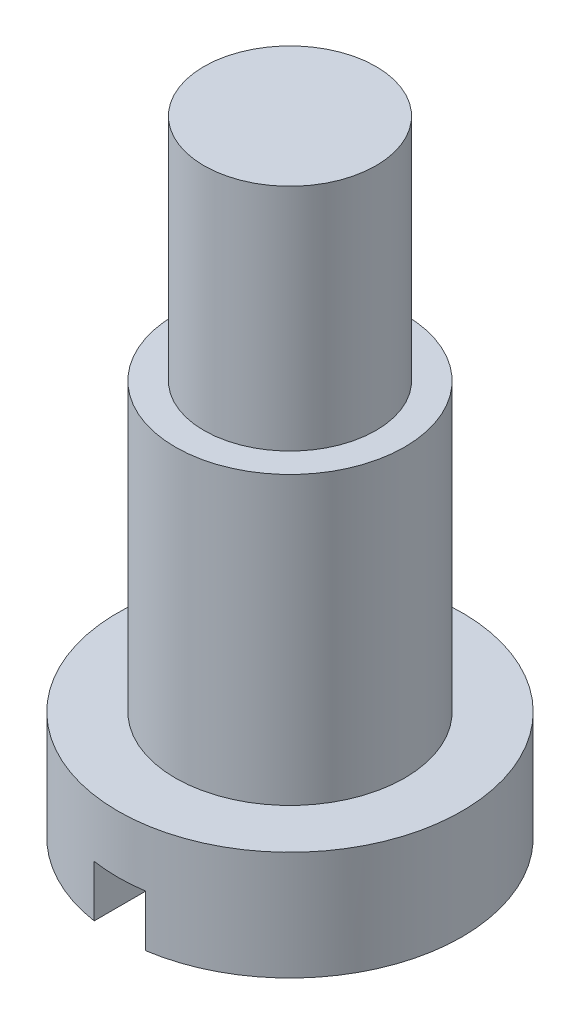
ISO-10303-21;
HEADER;
FILE_DESCRIPTION(('STEP AP214'),'2;1');
FILE_NAME('part.step','',(''),(''),'','','');
FILE_SCHEMA(('AUTOMOTIVE_DESIGN { 1 0 10303 214 1 1 1 1 }'));
ENDSEC;
DATA;
#1=APPLICATION_CONTEXT('core data for automotive mechanical design processes');
#2=APPLICATION_PROTOCOL_DEFINITION('international standard','automotive_design',2000,#1);
#3=PRODUCT_CONTEXT('',#1,'mechanical');
#4=PRODUCT('Part','Part','',(#3));
#5=PRODUCT_RELATED_PRODUCT_CATEGORY('part','',(#4));
#6=PRODUCT_DEFINITION_FORMATION('','',#4);
#7=PRODUCT_DEFINITION_CONTEXT('part definition',#1,'design');
#8=PRODUCT_DEFINITION('design','',#6,#7);
#9=PRODUCT_DEFINITION_SHAPE('','',#8);
#10=(LENGTH_UNIT() NAMED_UNIT(*) SI_UNIT(.MILLI.,.METRE.));
#11=(NAMED_UNIT(*) PLANE_ANGLE_UNIT() SI_UNIT($,.RADIAN.));
#12=(NAMED_UNIT(*) SI_UNIT($,.STERADIAN.) SOLID_ANGLE_UNIT());
#13=UNCERTAINTY_MEASURE_WITH_UNIT(LENGTH_MEASURE(1.E-05),#10,'distance_accuracy_value','');
#14=(GEOMETRIC_REPRESENTATION_CONTEXT(3) GLOBAL_UNCERTAINTY_ASSIGNED_CONTEXT((#13)) GLOBAL_UNIT_ASSIGNED_CONTEXT((#10,
#11,#12)) REPRESENTATION_CONTEXT('',''));
#15=CARTESIAN_POINT('',(0.,0.,0.));
#16=DIRECTION('',(0.,0.,1.));
#17=DIRECTION('',(1.,0.,0.));
#18=AXIS2_PLACEMENT_3D('',#15,#16,#17);
#19=CARTESIAN_POINT('',(0.,0.,0.));
#20=DIRECTION('',(0.,1.,0.));
#21=DIRECTION('',(0.,0.,1.));
#22=AXIS2_PLACEMENT_3D('',#19,#20,#21);
#23=PLANE('',#22);
#24=CARTESIAN_POINT('',(0.,0.,0.));
#25=DIRECTION('',(0.,1.,0.));
#26=DIRECTION('',(0.,0.,1.));
#27=AXIS2_PLACEMENT_3D('',#24,#25,#26);
#28=CIRCLE('',#27,6.);
#29=CARTESIAN_POINT('',(0.899999999999999,0.,5.93211597998556));
#30=VERTEX_POINT('',#29);
#31=CARTESIAN_POINT('',(0.900000000000001,0.,-5.93211597998555));
#32=VERTEX_POINT('',#31);
#33=EDGE_CURVE('E98',#30,#32,#28,.T.);
#34=ORIENTED_EDGE('',*,*,#33,.F.);
#35=DIRECTION('',(0.,0.,-1.));
#36=VECTOR('',#35,1.);
#37=CARTESIAN_POINT('',(0.9,0.,0.));
#38=LINE('',#37,#36);
#39=EDGE_CURVE('E86',#30,#32,#38,.T.);
#40=ORIENTED_EDGE('',*,*,#39,.T.);
#41=EDGE_LOOP('',(#34,#40));
#42=FACE_BOUND('',#41,.T.);
#43=ADVANCED_FACE('F39',(#42),#23,.F.);
#44=CARTESIAN_POINT('',(0.,3.8,0.));
#45=DIRECTION('',(0.,-1.,0.));
#46=DIRECTION('',(0.,0.,-1.));
#47=AXIS2_PLACEMENT_3D('',#44,#45,#46);
#48=CYLINDRICAL_SURFACE('',#47,6.);
#49=CARTESIAN_POINT('',(0.,1.8,0.));
#50=DIRECTION('',(0.,-1.,0.));
#51=DIRECTION('',(0.,0.,-1.));
#52=AXIS2_PLACEMENT_3D('',#49,#50,#51);
#53=CIRCLE('',#52,6.);
#54=CARTESIAN_POINT('',(0.899999999999999,1.8,5.93211597998556));
#55=VERTEX_POINT('',#54);
#56=CARTESIAN_POINT('',(-0.9,1.8,5.93211597998556));
#57=VERTEX_POINT('',#56);
#58=EDGE_CURVE('E11',#55,#57,#53,.T.);
#59=ORIENTED_EDGE('',*,*,#58,.F.);
#60=DIRECTION('',(0.,-1.,0.));
#61=VECTOR('',#60,1.);
#62=CARTESIAN_POINT('',(0.899999999999999,3.8,5.93211597998556));
#63=LINE('',#62,#61);
#64=EDGE_CURVE('E62',#55,#30,#63,.T.);
#65=ORIENTED_EDGE('',*,*,#64,.T.);
#66=ORIENTED_EDGE('',*,*,#33,.T.);
#67=DIRECTION('',(0.,-1.,0.));
#68=VECTOR('',#67,1.);
#69=CARTESIAN_POINT('',(0.900000000000001,3.8,-5.93211597998556));
#70=LINE('',#69,#68);
#71=CARTESIAN_POINT('',(0.9,1.8,-5.93211597998556));
#72=VERTEX_POINT('',#71);
#73=EDGE_CURVE('E95',#32,#72,#70,.F.);
#74=ORIENTED_EDGE('',*,*,#73,.T.);
#75=CARTESIAN_POINT('',(-0.899999999999999,1.8,-5.93211597998556));
#76=VERTEX_POINT('',#75);
#77=EDGE_CURVE('E43',#76,#72,#53,.T.);
#78=ORIENTED_EDGE('',*,*,#77,.F.);
#79=DIRECTION('',(0.,-1.,0.));
#80=VECTOR('',#79,1.);
#81=CARTESIAN_POINT('',(-0.899999999999999,3.8,-5.93211597998556));
#82=LINE('',#81,#80);
#83=CARTESIAN_POINT('',(-0.899999999999999,0.,-5.93211597998555));
#84=VERTEX_POINT('',#83);
#85=EDGE_CURVE('E81',#76,#84,#82,.T.);
#86=ORIENTED_EDGE('',*,*,#85,.T.);
#87=CARTESIAN_POINT('',(-0.900000000000001,0.,5.93211597998556));
#88=VERTEX_POINT('',#87);
#89=EDGE_CURVE('E93',#84,#88,#28,.T.);
#90=ORIENTED_EDGE('',*,*,#89,.T.);
#91=DIRECTION('',(0.,-1.,0.));
#92=VECTOR('',#91,1.);
#93=CARTESIAN_POINT('',(-0.900000000000001,3.8,5.93211597998556));
#94=LINE('',#93,#92);
#95=EDGE_CURVE('E54',#88,#57,#94,.F.);
#96=ORIENTED_EDGE('',*,*,#95,.T.);
#97=EDGE_LOOP('',(#59,#65,#66,#74,#78,#86,#90,#96));
#98=FACE_BOUND('',#97,.T.);
#99=CARTESIAN_POINT('',(0.,3.8,0.));
#100=DIRECTION('',(0.,1.,0.));
#101=DIRECTION('',(0.,0.,1.));
#102=AXIS2_PLACEMENT_3D('',#99,#100,#101);
#103=CIRCLE('',#102,6.);
#104=CARTESIAN_POINT('',(0.,3.8,6.));
#105=VERTEX_POINT('',#104);
#106=EDGE_CURVE('E102',#105,#105,#103,.T.);
#107=ORIENTED_EDGE('',*,*,#106,.F.);
#108=EDGE_LOOP('',(#107));
#109=FACE_BOUND('',#108,.T.);
#110=ADVANCED_FACE('F41',(#98,#109),#48,.T.);
#111=CARTESIAN_POINT('',(0.,3.8,0.));
#112=DIRECTION('',(0.,1.,0.));
#113=DIRECTION('',(0.,0.,1.));
#114=AXIS2_PLACEMENT_3D('',#111,#112,#113);
#115=PLANE('',#114);
#116=CARTESIAN_POINT('',(0.,3.8,0.));
#117=DIRECTION('',(0.,1.,0.));
#118=DIRECTION('',(0.,0.,1.));
#119=AXIS2_PLACEMENT_3D('',#116,#117,#118);
#120=CIRCLE('',#119,4.);
#121=CARTESIAN_POINT('',(0.,3.8,4.));
#122=VERTEX_POINT('',#121);
#123=EDGE_CURVE('E124',#122,#122,#120,.T.);
#124=ORIENTED_EDGE('',*,*,#123,.F.);
#125=EDGE_LOOP('',(#124));
#126=FACE_BOUND('',#125,.T.);
#127=ORIENTED_EDGE('',*,*,#106,.T.);
#128=EDGE_LOOP('',(#127));
#129=FACE_BOUND('',#128,.T.);
#130=ADVANCED_FACE('F131',(#126,#129),#115,.T.);
#131=ORIENTED_EDGE('',*,*,#89,.F.);
#132=DIRECTION('',(0.,0.,1.));
#133=VECTOR('',#132,1.);
#134=CARTESIAN_POINT('',(-0.9,0.,0.));
#135=LINE('',#134,#133);
#136=EDGE_CURVE('E78',#84,#88,#135,.T.);
#137=ORIENTED_EDGE('',*,*,#136,.T.);
#138=EDGE_LOOP('',(#131,#137));
#139=FACE_BOUND('',#138,.T.);
#140=ADVANCED_FACE('F97',(#139),#23,.F.);
#141=CARTESIAN_POINT('',(0.,13.8,0.));
#142=DIRECTION('',(0.,-1.,0.));
#143=DIRECTION('',(0.,0.,-1.));
#144=AXIS2_PLACEMENT_3D('',#141,#142,#143);
#145=CYLINDRICAL_SURFACE('',#144,4.);
#146=CARTESIAN_POINT('',(0.,13.8,0.));
#147=DIRECTION('',(0.,1.,0.));
#148=DIRECTION('',(0.,0.,1.));
#149=AXIS2_PLACEMENT_3D('',#146,#147,#148);
#150=CIRCLE('',#149,4.);
#151=CARTESIAN_POINT('',(0.,13.8,4.));
#152=VERTEX_POINT('',#151);
#153=EDGE_CURVE('E99',#152,#152,#150,.T.);
#154=ORIENTED_EDGE('',*,*,#153,.F.);
#155=EDGE_LOOP('',(#154));
#156=FACE_BOUND('',#155,.T.);
#157=ORIENTED_EDGE('',*,*,#123,.T.);
#158=EDGE_LOOP('',(#157));
#159=FACE_BOUND('',#158,.T.);
#160=ADVANCED_FACE('F143',(#156,#159),#145,.T.);
#161=CARTESIAN_POINT('',(0.,13.8,0.));
#162=DIRECTION('',(0.,1.,0.));
#163=DIRECTION('',(0.,0.,1.));
#164=AXIS2_PLACEMENT_3D('',#161,#162,#163);
#165=PLANE('',#164);
#166=CARTESIAN_POINT('',(0.,13.8,0.));
#167=DIRECTION('',(0.,1.,0.));
#168=DIRECTION('',(0.,0.,1.));
#169=AXIS2_PLACEMENT_3D('',#166,#167,#168);
#170=CIRCLE('',#169,3.);
#171=CARTESIAN_POINT('',(0.,13.8,3.));
#172=VERTEX_POINT('',#171);
#173=EDGE_CURVE('E87',#172,#172,#170,.T.);
#174=ORIENTED_EDGE('',*,*,#173,.F.);
#175=EDGE_LOOP('',(#174));
#176=FACE_BOUND('',#175,.T.);
#177=ORIENTED_EDGE('',*,*,#153,.T.);
#178=EDGE_LOOP('',(#177));
#179=FACE_BOUND('',#178,.T.);
#180=ADVANCED_FACE('F148',(#176,#179),#165,.T.);
#181=CARTESIAN_POINT('',(0.,21.8,0.));
#182=DIRECTION('',(0.,-1.,0.));
#183=DIRECTION('',(0.,0.,-1.));
#184=AXIS2_PLACEMENT_3D('',#181,#182,#183);
#185=CYLINDRICAL_SURFACE('',#184,3.);
#186=CARTESIAN_POINT('',(0.,21.8,0.));
#187=DIRECTION('',(0.,1.,0.));
#188=DIRECTION('',(0.,0.,1.));
#189=AXIS2_PLACEMENT_3D('',#186,#187,#188);
#190=CIRCLE('',#189,3.);
#191=CARTESIAN_POINT('',(0.,21.8,3.));
#192=VERTEX_POINT('',#191);
#193=EDGE_CURVE('E104',#192,#192,#190,.T.);
#194=ORIENTED_EDGE('',*,*,#193,.F.);
#195=EDGE_LOOP('',(#194));
#196=FACE_BOUND('',#195,.T.);
#197=ORIENTED_EDGE('',*,*,#173,.T.);
#198=EDGE_LOOP('',(#197));
#199=FACE_BOUND('',#198,.T.);
#200=ADVANCED_FACE('F154',(#196,#199),#185,.T.);
#201=CARTESIAN_POINT('',(0.,21.8,0.));
#202=DIRECTION('',(0.,1.,0.));
#203=DIRECTION('',(0.,0.,1.));
#204=AXIS2_PLACEMENT_3D('',#201,#202,#203);
#205=PLANE('',#204);
#206=ORIENTED_EDGE('',*,*,#193,.T.);
#207=EDGE_LOOP('',(#206));
#208=FACE_BOUND('',#207,.T.);
#209=ADVANCED_FACE('F161',(#208),#205,.T.);
#210=CARTESIAN_POINT('',(0.,1.8,0.));
#211=DIRECTION('',(0.,-1.,0.));
#212=DIRECTION('',(0.,0.,-1.));
#213=AXIS2_PLACEMENT_3D('',#210,#211,#212);
#214=PLANE('',#213);
#215=ORIENTED_EDGE('',*,*,#58,.T.);
#216=DIRECTION('',(0.,0.,-1.));
#217=VECTOR('',#216,1.);
#218=CARTESIAN_POINT('',(-0.900000000000001,1.8,6.96048138187417));
#219=LINE('',#218,#217);
#220=EDGE_CURVE('E114',#57,#76,#219,.T.);
#221=ORIENTED_EDGE('',*,*,#220,.T.);
#222=ORIENTED_EDGE('',*,*,#77,.T.);
#223=DIRECTION('',(0.,0.,1.));
#224=VECTOR('',#223,1.);
#225=CARTESIAN_POINT('',(0.899999999999999,1.8,6.96048138187417));
#226=LINE('',#225,#224);
#227=EDGE_CURVE('E113',#72,#55,#226,.T.);
#228=ORIENTED_EDGE('',*,*,#227,.T.);
#229=EDGE_LOOP('',(#215,#221,#222,#228));
#230=FACE_BOUND('',#229,.T.);
#231=ADVANCED_FACE('F112',(#230),#214,.T.);
#232=CARTESIAN_POINT('',(0.899999999999999,1.8,6.96048138187417));
#233=DIRECTION('',(1.,0.,0.));
#234=DIRECTION('',(0.,0.,-1.));
#235=AXIS2_PLACEMENT_3D('',#232,#233,#234);
#236=PLANE('',#235);
#237=ORIENTED_EDGE('',*,*,#227,.F.);
#238=ORIENTED_EDGE('',*,*,#73,.F.);
#239=ORIENTED_EDGE('',*,*,#39,.F.);
#240=ORIENTED_EDGE('',*,*,#64,.F.);
#241=EDGE_LOOP('',(#237,#238,#239,#240));
#242=FACE_BOUND('',#241,.T.);
#243=ADVANCED_FACE('F115',(#242),#236,.F.);
#244=CARTESIAN_POINT('',(-0.900000000000001,1.8,6.96048138187417));
#245=DIRECTION('',(-1.,0.,0.));
#246=DIRECTION('',(0.,0.,1.));
#247=AXIS2_PLACEMENT_3D('',#244,#245,#246);
#248=PLANE('',#247);
#249=ORIENTED_EDGE('',*,*,#220,.F.);
#250=ORIENTED_EDGE('',*,*,#95,.F.);
#251=ORIENTED_EDGE('',*,*,#136,.F.);
#252=ORIENTED_EDGE('',*,*,#85,.F.);
#253=EDGE_LOOP('',(#249,#250,#251,#252));
#254=FACE_BOUND('',#253,.T.);
#255=ADVANCED_FACE('F80',(#254),#248,.F.);
#256=CLOSED_SHELL('',(#43,#110,#130,#140,#160,#180,#200,#209,#231,#243,#255));
#257=MANIFOLD_SOLID_BREP('B2',#256);
#258=ADVANCED_BREP_SHAPE_REPRESENTATION('',(#18,#257),#14);
#259=SHAPE_DEFINITION_REPRESENTATION(#9,#258);
ENDSEC;
END-ISO-10303-21;
